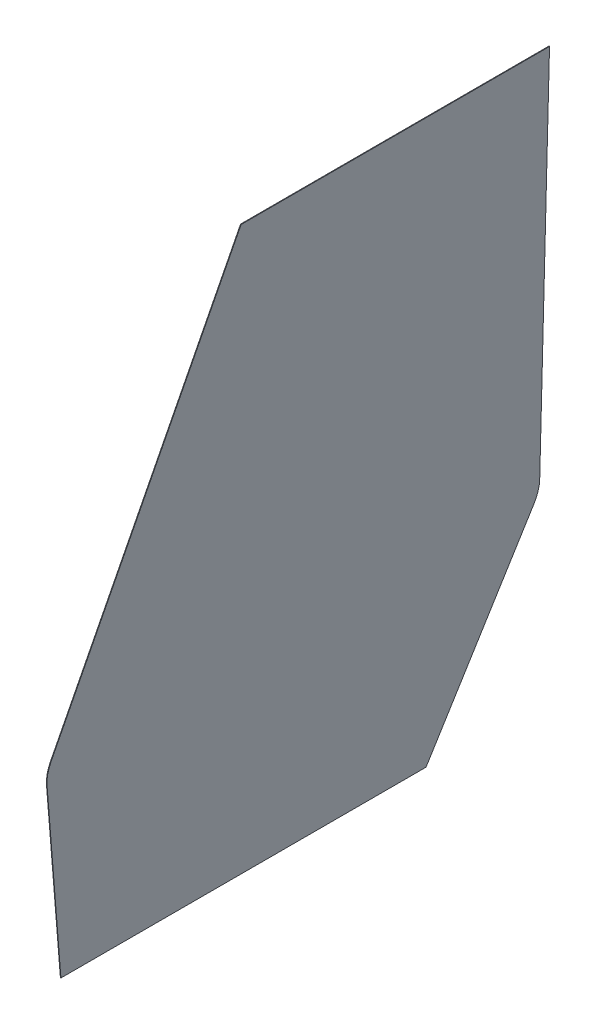
ISO-10303-21;
HEADER;
FILE_DESCRIPTION(('STEP AP214'),'2;1');
FILE_NAME('part.step','',(''),(''),'','','');
FILE_SCHEMA(('AUTOMOTIVE_DESIGN { 1 0 10303 214 1 1 1 1 }'));
ENDSEC;
DATA;
#1=APPLICATION_CONTEXT('core data for automotive mechanical design processes');
#2=APPLICATION_PROTOCOL_DEFINITION('international standard','automotive_design',2000,#1);
#3=PRODUCT_CONTEXT('',#1,'mechanical');
#4=PRODUCT('Part','Part','',(#3));
#5=PRODUCT_RELATED_PRODUCT_CATEGORY('part','',(#4));
#6=PRODUCT_DEFINITION_FORMATION('','',#4);
#7=PRODUCT_DEFINITION_CONTEXT('part definition',#1,'design');
#8=PRODUCT_DEFINITION('design','',#6,#7);
#9=PRODUCT_DEFINITION_SHAPE('','',#8);
#10=(LENGTH_UNIT() NAMED_UNIT(*) SI_UNIT(.MILLI.,.METRE.));
#11=(NAMED_UNIT(*) PLANE_ANGLE_UNIT() SI_UNIT($,.RADIAN.));
#12=(NAMED_UNIT(*) SI_UNIT($,.STERADIAN.) SOLID_ANGLE_UNIT());
#13=UNCERTAINTY_MEASURE_WITH_UNIT(LENGTH_MEASURE(1.E-05),#10,'distance_accuracy_value','');
#14=(GEOMETRIC_REPRESENTATION_CONTEXT(3) GLOBAL_UNCERTAINTY_ASSIGNED_CONTEXT((#13)) GLOBAL_UNIT_ASSIGNED_CONTEXT((#10,
#11,#12)) REPRESENTATION_CONTEXT('',''));
#15=CARTESIAN_POINT('',(0.,0.,0.));
#16=DIRECTION('',(0.,0.,1.));
#17=DIRECTION('',(1.,0.,0.));
#18=AXIS2_PLACEMENT_3D('',#15,#16,#17);
#19=CARTESIAN_POINT('',(234.019484665081,-138.163906506796,350.));
#20=DIRECTION('',(-0.978147600733806,0.207911690817756,0.));
#21=DIRECTION('',(-0.207911690817756,-0.978147600733806,0.));
#22=AXIS2_PLACEMENT_3D('',#19,#20,#21);
#23=CYLINDRICAL_SURFACE('',#22,100.000000000013);
#24=CARTESIAN_POINT('',(233.041337064348,-137.955994815979,350.));
#25=DIRECTION('',(0.978147600733806,-0.207911690817756,0.));
#26=DIRECTION('',(0.207911690817756,0.978147600733806,0.));
#27=AXIS2_PLACEMENT_3D('',#24,#25,#26);
#28=CIRCLE('',#27,100.000000000013);
#29=CARTESIAN_POINT('',(236.872911156409,-119.929855975767,448.287218693445));
#30=VERTEX_POINT('',#29);
#31=CARTESIAN_POINT('',(227.631693945645,-163.406364713761,446.555758157641));
#32=VERTEX_POINT('',#31);
#33=EDGE_CURVE('E146',#30,#32,#28,.T.);
#34=ORIENTED_EDGE('',*,*,#33,.T.);
#35=DIRECTION('',(-0.978147600733806,0.207911690817756,0.));
#36=VECTOR('',#35,1.);
#37=CARTESIAN_POINT('',(228.609841546379,-163.614276404579,446.555758157641));
#38=LINE('',#37,#36);
#39=CARTESIAN_POINT('',(228.609841546379,-163.614276404579,446.555758157641));
#40=VERTEX_POINT('',#39);
#41=EDGE_CURVE('E11',#40,#32,#38,.T.);
#42=ORIENTED_EDGE('',*,*,#41,.F.);
#43=CARTESIAN_POINT('',(234.019484665081,-138.163906506796,350.));
#44=DIRECTION('',(0.978147600733806,-0.207911690817756,0.));
#45=DIRECTION('',(0.207911690817756,0.978147600733806,0.));
#46=AXIS2_PLACEMENT_3D('',#43,#44,#45);
#47=CIRCLE('',#46,100.000000000013);
#48=CARTESIAN_POINT('',(237.851058757143,-120.137767666585,448.287218693445));
#49=VERTEX_POINT('',#48);
#50=EDGE_CURVE('E168',#49,#40,#47,.T.);
#51=ORIENTED_EDGE('',*,*,#50,.F.);
#52=DIRECTION('',(-0.978147600733806,0.207911690817756,0.));
#53=VECTOR('',#52,1.);
#54=CARTESIAN_POINT('',(237.851058757143,-120.137767666585,448.287218693445));
#55=LINE('',#54,#53);
#56=EDGE_CURVE('E142',#49,#30,#55,.T.);
#57=ORIENTED_EDGE('',*,*,#56,.T.);
#58=EDGE_LOOP('',(#34,#42,#51,#57));
#59=FACE_BOUND('',#58,.T.);
#60=ADVANCED_FACE('F45',(#59),#23,.T.);
#61=CARTESIAN_POINT('',(142.538340705268,-568.548850829676,335.));
#62=DIRECTION('',(0.0540964311870218,0.254503698977795,-0.965557581576287));
#63=DIRECTION('',(0.,0.966973505406162,0.254876911160113));
#64=AXIS2_PLACEMENT_3D('',#61,#62,#63);
#65=PLANE('',#64);
#66=DIRECTION('',(-0.200750709367429,-0.944457831789181,-0.260189463008309));
#67=VECTOR('',#66,1.);
#68=CARTESIAN_POINT('',(141.560193104534,-568.340939138859,335.));
#69=LINE('',#68,#67);
#70=CARTESIAN_POINT('',(141.560193104534,-568.340939138859,335.));
#71=VERTEX_POINT('',#70);
#72=EDGE_CURVE('E150',#32,#71,#69,.T.);
#73=ORIENTED_EDGE('',*,*,#72,.T.);
#74=DIRECTION('',(-0.978147600733806,0.207911690817756,0.));
#75=VECTOR('',#74,1.);
#76=CARTESIAN_POINT('',(142.538340705268,-568.548850829676,335.));
#77=LINE('',#76,#75);
#78=CARTESIAN_POINT('',(142.538340705268,-568.548850829676,335.));
#79=VERTEX_POINT('',#78);
#80=EDGE_CURVE('E54',#79,#71,#77,.T.);
#81=ORIENTED_EDGE('',*,*,#80,.F.);
#82=DIRECTION('',(-0.200750709367429,-0.944457831789181,-0.260189463008309));
#83=VECTOR('',#82,1.);
#84=CARTESIAN_POINT('',(142.538340705268,-568.548850829676,335.));
#85=LINE('',#84,#83);
#86=EDGE_CURVE('E105',#40,#79,#85,.T.);
#87=ORIENTED_EDGE('',*,*,#86,.F.);
#88=ORIENTED_EDGE('',*,*,#41,.T.);
#89=EDGE_LOOP('',(#73,#81,#87,#88));
#90=FACE_BOUND('',#89,.T.);
#91=ADVANCED_FACE('F214',(#90),#65,.F.);
#92=CARTESIAN_POINT('',(142.538340705268,-568.548850829676,-335.));
#93=DIRECTION('',(0.207911690817756,0.978147600733806,0.));
#94=DIRECTION('',(-0.978147600733806,0.207911690817756,0.));
#95=AXIS2_PLACEMENT_3D('',#92,#93,#94);
#96=PLANE('',#95);
#97=DIRECTION('',(0.,0.,-1.));
#98=VECTOR('',#97,1.);
#99=CARTESIAN_POINT('',(141.560193104534,-568.340939138859,-335.));
#100=LINE('',#99,#98);
#101=CARTESIAN_POINT('',(141.560193104534,-568.340939138859,-335.));
#102=VERTEX_POINT('',#101);
#103=EDGE_CURVE('E153',#71,#102,#100,.T.);
#104=ORIENTED_EDGE('',*,*,#103,.T.);
#105=DIRECTION('',(-0.978147600733806,0.207911690817756,0.));
#106=VECTOR('',#105,1.);
#107=CARTESIAN_POINT('',(142.538340705268,-568.548850829676,-335.));
#108=LINE('',#107,#106);
#109=CARTESIAN_POINT('',(142.538340705268,-568.548850829676,-335.));
#110=VERTEX_POINT('',#109);
#111=EDGE_CURVE('E179',#110,#102,#108,.T.);
#112=ORIENTED_EDGE('',*,*,#111,.F.);
#113=DIRECTION('',(0.,0.,-1.));
#114=VECTOR('',#113,1.);
#115=CARTESIAN_POINT('',(142.538340705268,-568.548850829676,-335.));
#116=LINE('',#115,#114);
#117=EDGE_CURVE('E189',#79,#110,#116,.T.);
#118=ORIENTED_EDGE('',*,*,#117,.F.);
#119=ORIENTED_EDGE('',*,*,#80,.T.);
#120=EDGE_LOOP('',(#104,#112,#118,#119));
#121=FACE_BOUND('',#120,.T.);
#122=ADVANCED_FACE('F187',(#121),#96,.F.);
#123=CARTESIAN_POINT('',(142.538340705268,-568.548850829676,-335.));
#124=DIRECTION('',(0.0540964311870215,0.254503698977795,0.965557581576287));
#125=DIRECTION('',(0.,-0.966973505406161,0.254876911160113));
#126=AXIS2_PLACEMENT_3D('',#123,#124,#125);
#127=PLANE('',#126);
#128=DIRECTION('',(0.20075070936743,0.944457831789181,-0.260189463008309));
#129=VECTOR('',#128,1.);
#130=CARTESIAN_POINT('',(141.560193104534,-568.340939138859,-335.));
#131=LINE('',#130,#129);
#132=CARTESIAN_POINT('',(227.631693945645,-163.406364713761,-446.555758157641));
#133=VERTEX_POINT('',#132);
#134=EDGE_CURVE('E156',#102,#133,#131,.T.);
#135=ORIENTED_EDGE('',*,*,#134,.T.);
#136=DIRECTION('',(-0.978147600733806,0.207911690817756,0.));
#137=VECTOR('',#136,1.);
#138=CARTESIAN_POINT('',(228.609841546379,-163.614276404579,-446.555758157641));
#139=LINE('',#138,#137);
#140=CARTESIAN_POINT('',(228.609841546379,-163.614276404579,-446.555758157641));
#141=VERTEX_POINT('',#140);
#142=EDGE_CURVE('E175',#141,#133,#139,.T.);
#143=ORIENTED_EDGE('',*,*,#142,.F.);
#144=DIRECTION('',(0.20075070936743,0.944457831789181,-0.260189463008309));
#145=VECTOR('',#144,1.);
#146=CARTESIAN_POINT('',(142.538340705268,-568.548850829676,-335.));
#147=LINE('',#146,#145);
#148=EDGE_CURVE('E202',#110,#141,#147,.T.);
#149=ORIENTED_EDGE('',*,*,#148,.F.);
#150=ORIENTED_EDGE('',*,*,#111,.T.);
#151=EDGE_LOOP('',(#135,#143,#149,#150));
#152=FACE_BOUND('',#151,.T.);
#153=ADVANCED_FACE('F197',(#152),#127,.F.);
#154=CARTESIAN_POINT('',(234.019484665081,-138.163906506797,-350.));
#155=DIRECTION('',(-0.978147600733806,0.207911690817756,0.));
#156=DIRECTION('',(-0.207911690817756,-0.978147600733806,0.));
#157=AXIS2_PLACEMENT_3D('',#154,#155,#156);
#158=CYLINDRICAL_SURFACE('',#157,100.000000000013);
#159=CARTESIAN_POINT('',(233.041337064348,-137.955994815979,-350.));
#160=DIRECTION('',(0.978147600733806,-0.207911690817756,0.));
#161=DIRECTION('',(0.207911690817756,0.978147600733806,0.));
#162=AXIS2_PLACEMENT_3D('',#159,#160,#161);
#163=CIRCLE('',#162,100.000000000013);
#164=CARTESIAN_POINT('',(236.872911156409,-119.929855975767,-448.287218693445));
#165=VERTEX_POINT('',#164);
#166=EDGE_CURVE('E159',#133,#165,#163,.T.);
#167=ORIENTED_EDGE('',*,*,#166,.T.);
#168=DIRECTION('',(-0.978147600733806,0.207911690817756,0.));
#169=VECTOR('',#168,1.);
#170=CARTESIAN_POINT('',(237.851058757143,-120.137767666585,-448.287218693445));
#171=LINE('',#170,#169);
#172=CARTESIAN_POINT('',(237.851058757143,-120.137767666585,-448.287218693445));
#173=VERTEX_POINT('',#172);
#174=EDGE_CURVE('E135',#173,#165,#171,.T.);
#175=ORIENTED_EDGE('',*,*,#174,.F.);
#176=CARTESIAN_POINT('',(234.019484665081,-138.163906506797,-350.));
#177=DIRECTION('',(0.978147600733806,-0.207911690817756,0.));
#178=DIRECTION('',(0.207911690817756,0.978147600733806,0.));
#179=AXIS2_PLACEMENT_3D('',#176,#177,#178);
#180=CIRCLE('',#179,100.000000000013);
#181=EDGE_CURVE('E124',#141,#173,#180,.T.);
#182=ORIENTED_EDGE('',*,*,#181,.F.);
#183=ORIENTED_EDGE('',*,*,#142,.T.);
#184=EDGE_LOOP('',(#167,#175,#182,#183));
#185=FACE_BOUND('',#184,.T.);
#186=ADVANCED_FACE('F200',(#185),#158,.T.);
#187=CARTESIAN_POINT('',(237.851058757143,-120.137767666585,-448.287218693445));
#188=DIRECTION('',(-0.0383157409206121,-0.180261388402089,0.982872186934321));
#189=DIRECTION('',(0.,-0.983594457667973,-0.180393854786815));
#190=AXIS2_PLACEMENT_3D('',#187,#188,#189);
#191=PLANE('',#190);
#192=DIRECTION('',(0.204350618243261,0.961394071477796,0.184288535050188));
#193=VECTOR('',#192,1.);
#194=CARTESIAN_POINT('',(236.872911156409,-119.929855975767,-448.287218693445));
#195=LINE('',#194,#193);
#196=CARTESIAN_POINT('',(420.161858800329,742.376845844448,-282.992628725634));
#197=VERTEX_POINT('',#196);
#198=EDGE_CURVE('E133',#165,#197,#195,.T.);
#199=ORIENTED_EDGE('',*,*,#198,.T.);
#200=DIRECTION('',(-0.978147600733806,0.207911690817756,0.));
#201=VECTOR('',#200,1.);
#202=CARTESIAN_POINT('',(421.140006401062,742.16893415363,-282.992628725634));
#203=LINE('',#202,#201);
#204=CARTESIAN_POINT('',(421.140006401062,742.16893415363,-282.992628725634));
#205=VERTEX_POINT('',#204);
#206=EDGE_CURVE('E130',#205,#197,#203,.T.);
#207=ORIENTED_EDGE('',*,*,#206,.F.);
#208=DIRECTION('',(0.204350618243261,0.961394071477796,0.184288535050188));
#209=VECTOR('',#208,1.);
#210=CARTESIAN_POINT('',(237.851058757143,-120.137767666585,-448.287218693445));
#211=LINE('',#210,#209);
#212=EDGE_CURVE('E118',#173,#205,#211,.T.);
#213=ORIENTED_EDGE('',*,*,#212,.F.);
#214=ORIENTED_EDGE('',*,*,#174,.T.);
#215=EDGE_LOOP('',(#199,#207,#213,#214));
#216=FACE_BOUND('',#215,.T.);
#217=ADVANCED_FACE('F131',(#216),#191,.F.);
#218=CARTESIAN_POINT('',(421.140006401062,742.16893415363,-282.992628725634));
#219=DIRECTION('',(-0.207911690817756,-0.978147600733806,0.));
#220=DIRECTION('',(0.978147600733806,-0.207911690817756,0.));
#221=AXIS2_PLACEMENT_3D('',#218,#219,#220);
#222=PLANE('',#221);
#223=DIRECTION('',(0.,0.,1.));
#224=VECTOR('',#223,1.);
#225=CARTESIAN_POINT('',(420.161858800329,742.376845844448,-282.992628725634));
#226=LINE('',#225,#224);
#227=CARTESIAN_POINT('',(420.161858800328,742.376845844448,282.992628725634));
#228=VERTEX_POINT('',#227);
#229=EDGE_CURVE('E91',#197,#228,#226,.T.);
#230=ORIENTED_EDGE('',*,*,#229,.T.);
#231=DIRECTION('',(-0.978147600733806,0.207911690817756,0.));
#232=VECTOR('',#231,1.);
#233=CARTESIAN_POINT('',(421.140006401062,742.16893415363,282.992628725634));
#234=LINE('',#233,#232);
#235=CARTESIAN_POINT('',(421.140006401062,742.16893415363,282.992628725634));
#236=VERTEX_POINT('',#235);
#237=EDGE_CURVE('E136',#236,#228,#234,.T.);
#238=ORIENTED_EDGE('',*,*,#237,.F.);
#239=DIRECTION('',(0.,0.,1.));
#240=VECTOR('',#239,1.);
#241=CARTESIAN_POINT('',(421.140006401062,742.16893415363,-282.992628725634));
#242=LINE('',#241,#240);
#243=EDGE_CURVE('E122',#205,#236,#242,.T.);
#244=ORIENTED_EDGE('',*,*,#243,.F.);
#245=ORIENTED_EDGE('',*,*,#206,.T.);
#246=EDGE_LOOP('',(#230,#238,#244,#245));
#247=FACE_BOUND('',#246,.T.);
#248=ADVANCED_FACE('F138',(#247),#222,.F.);
#249=CARTESIAN_POINT('',(237.851058757143,-120.137767666585,448.287218693445));
#250=DIRECTION('',(-0.0383157409206118,-0.180261388402089,-0.982872186934321));
#251=DIRECTION('',(0.,0.983594457667973,-0.180393854786815));
#252=AXIS2_PLACEMENT_3D('',#249,#250,#251);
#253=PLANE('',#252);
#254=DIRECTION('',(-0.204350618243261,-0.961394071477796,0.184288535050188));
#255=VECTOR('',#254,1.);
#256=CARTESIAN_POINT('',(236.872911156409,-119.929855975767,448.287218693445));
#257=LINE('',#256,#255);
#258=EDGE_CURVE('E97',#228,#30,#257,.T.);
#259=ORIENTED_EDGE('',*,*,#258,.T.);
#260=ORIENTED_EDGE('',*,*,#56,.F.);
#261=DIRECTION('',(-0.204350618243261,-0.961394071477796,0.184288535050188));
#262=VECTOR('',#261,1.);
#263=CARTESIAN_POINT('',(237.851058757143,-120.137767666585,448.287218693445));
#264=LINE('',#263,#262);
#265=EDGE_CURVE('E62',#236,#49,#264,.T.);
#266=ORIENTED_EDGE('',*,*,#265,.F.);
#267=ORIENTED_EDGE('',*,*,#237,.T.);
#268=EDGE_LOOP('',(#259,#260,#266,#267));
#269=FACE_BOUND('',#268,.T.);
#270=ADVANCED_FACE('F230',(#269),#253,.F.);
#271=CARTESIAN_POINT('',(234.019484665081,-138.163906506796,350.));
#272=DIRECTION('',(0.978147600733806,-0.207911690817756,0.));
#273=DIRECTION('',(0.207911690817756,0.978147600733806,0.));
#274=AXIS2_PLACEMENT_3D('',#271,#272,#273);
#275=PLANE('',#274);
#276=ORIENTED_EDGE('',*,*,#50,.T.);
#277=ORIENTED_EDGE('',*,*,#86,.T.);
#278=ORIENTED_EDGE('',*,*,#117,.T.);
#279=ORIENTED_EDGE('',*,*,#148,.T.);
#280=ORIENTED_EDGE('',*,*,#181,.T.);
#281=ORIENTED_EDGE('',*,*,#212,.T.);
#282=ORIENTED_EDGE('',*,*,#243,.T.);
#283=ORIENTED_EDGE('',*,*,#265,.T.);
#284=EDGE_LOOP('',(#276,#277,#278,#279,#280,#281,#282,#283));
#285=FACE_BOUND('',#284,.T.);
#286=ADVANCED_FACE('F120',(#285),#275,.T.);
#287=CARTESIAN_POINT('',(233.041337064348,-137.955994815979,350.));
#288=DIRECTION('',(0.978147600733806,-0.207911690817756,0.));
#289=DIRECTION('',(0.207911690817756,0.978147600733806,0.));
#290=AXIS2_PLACEMENT_3D('',#287,#288,#289);
#291=PLANE('',#290);
#292=ORIENTED_EDGE('',*,*,#33,.F.);
#293=ORIENTED_EDGE('',*,*,#258,.F.);
#294=ORIENTED_EDGE('',*,*,#229,.F.);
#295=ORIENTED_EDGE('',*,*,#198,.F.);
#296=ORIENTED_EDGE('',*,*,#166,.F.);
#297=ORIENTED_EDGE('',*,*,#134,.F.);
#298=ORIENTED_EDGE('',*,*,#103,.F.);
#299=ORIENTED_EDGE('',*,*,#72,.F.);
#300=EDGE_LOOP('',(#292,#293,#294,#295,#296,#297,#298,#299));
#301=FACE_BOUND('',#300,.T.);
#302=ADVANCED_FACE('F193',(#301),#291,.F.);
#303=CLOSED_SHELL('',(#60,#91,#122,#153,#186,#217,#248,#270,#286,#302));
#304=MANIFOLD_SOLID_BREP('B2',#303);
#305=ADVANCED_BREP_SHAPE_REPRESENTATION('',(#18,#304),#14);
#306=SHAPE_DEFINITION_REPRESENTATION(#9,#305);
ENDSEC;
END-ISO-10303-21;
